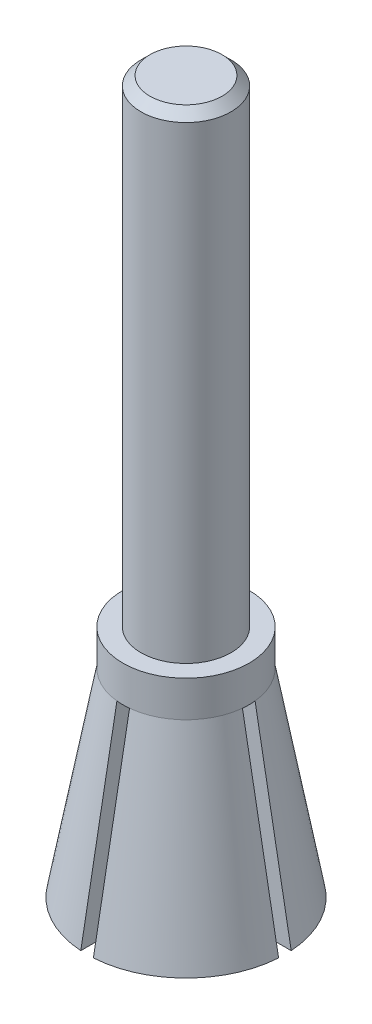
ISO-10303-21;
HEADER;
FILE_DESCRIPTION(('STEP AP214'),'2;1');
FILE_NAME('part.step','',(''),(''),'','','');
FILE_SCHEMA(('AUTOMOTIVE_DESIGN { 1 0 10303 214 1 1 1 1 }'));
ENDSEC;
DATA;
#1=APPLICATION_CONTEXT('core data for automotive mechanical design processes');
#2=APPLICATION_PROTOCOL_DEFINITION('international standard','automotive_design',2000,#1);
#3=PRODUCT_CONTEXT('',#1,'mechanical');
#4=PRODUCT('Part','Part','',(#3));
#5=PRODUCT_RELATED_PRODUCT_CATEGORY('part','',(#4));
#6=PRODUCT_DEFINITION_FORMATION('','',#4);
#7=PRODUCT_DEFINITION_CONTEXT('part definition',#1,'design');
#8=PRODUCT_DEFINITION('design','',#6,#7);
#9=PRODUCT_DEFINITION_SHAPE('','',#8);
#10=(LENGTH_UNIT() NAMED_UNIT(*) SI_UNIT(.MILLI.,.METRE.));
#11=(NAMED_UNIT(*) PLANE_ANGLE_UNIT() SI_UNIT($,.RADIAN.));
#12=(NAMED_UNIT(*) SI_UNIT($,.STERADIAN.) SOLID_ANGLE_UNIT());
#13=UNCERTAINTY_MEASURE_WITH_UNIT(LENGTH_MEASURE(1.E-05),#10,'distance_accuracy_value','');
#14=(GEOMETRIC_REPRESENTATION_CONTEXT(3) GLOBAL_UNCERTAINTY_ASSIGNED_CONTEXT((#13)) GLOBAL_UNIT_ASSIGNED_CONTEXT((#10,
#11,#12)) REPRESENTATION_CONTEXT('',''));
#15=CARTESIAN_POINT('',(0.,0.,0.));
#16=DIRECTION('',(0.,0.,1.));
#17=DIRECTION('',(1.,0.,0.));
#18=AXIS2_PLACEMENT_3D('',#15,#16,#17);
#19=CARTESIAN_POINT('',(0.,0.,0.));
#20=DIRECTION('',(0.,-1.,0.));
#21=DIRECTION('',(0.,0.,1.));
#22=AXIS2_PLACEMENT_3D('',#19,#20,#21);
#23=CONICAL_SURFACE('',#22,5.5,0.179768912955416);
#24=CARTESIAN_POINT('',(0.,11.,0.));
#25=DIRECTION('',(0.,1.,0.));
#26=DIRECTION('',(0.,0.,1.));
#27=AXIS2_PLACEMENT_3D('',#24,#25,#26);
#28=CIRCLE('',#27,3.50096119927712);
#29=CARTESIAN_POINT('',(0.35,11.,3.48342207015514));
#30=VERTEX_POINT('',#29);
#31=CARTESIAN_POINT('',(3.48342207015514,11.,0.349999999999988));
#32=VERTEX_POINT('',#31);
#33=EDGE_CURVE('E292',#30,#32,#28,.T.);
#34=ORIENTED_EDGE('',*,*,#33,.F.);
#35=CARTESIAN_POINT('',(0.350000000000001,22.5495894646429,1.35765620298964));
#36=CARTESIAN_POINT('',(0.350000000000001,22.1599275652389,1.43076601837478));
#37=CARTESIAN_POINT('',(0.350000000000001,21.7702066165525,1.50355977469193));
#38=CARTESIAN_POINT('',(0.350000000000001,20.9906786297959,1.64868315193357));
#39=CARTESIAN_POINT('',(0.35,20.6008715918012,1.72101277326361));
#40=CARTESIAN_POINT('',(0.35,19.4313686685646,1.9375575374505));
#41=CARTESIAN_POINT('',(0.35,18.6515906413776,2.08132864262808));
#42=CARTESIAN_POINT('',(0.35,17.0919202618659,2.36824965370763));
#43=CARTESIAN_POINT('',(0.35,16.3120279095134,2.51139955945829));
#44=CARTESIAN_POINT('',(0.35,14.7521731556098,2.79732677308865));
#45=CARTESIAN_POINT('',(0.35,13.9722107539093,2.9401040801528));
#46=CARTESIAN_POINT('',(0.35,12.4122421040325,3.22541832458637));
#47=CARTESIAN_POINT('',(0.35,11.6322358558618,3.36795526198624));
#48=CARTESIAN_POINT('',(0.35,8.98555155736385,3.85132896909272));
#49=CARTESIAN_POINT('',(0.35,7.11880541120568,4.19179282970911));
#50=CARTESIAN_POINT('',(0.35,3.38523806527127,4.87230942388104));
#51=CARTESIAN_POINT('',(0.35,1.51841686548874,5.21236215740201));
#52=CARTESIAN_POINT('',(0.35,-2.21525422019184,5.89223358945894));
#53=CARTESIAN_POINT('',(0.35,-4.0821041057853,6.23205228966753));
#54=CARTESIAN_POINT('',(0.35,-7.81583054353872,6.91154183330469));
#55=CARTESIAN_POINT('',(0.35,-9.6827070956953,7.25121267675186));
#56=CARTESIAN_POINT('',(0.35,-11.5495894646429,7.59085149434078));
#57=B_SPLINE_CURVE_WITH_KNOTS('',3,(#35,#36,#37,#38,#39,#40,#41,#42,#43,#44,#45,#46,#47,#48,#49,
#50,#51,#52,#53,#54,#55,#56),.UNSPECIFIED.,.F.,.F.,(4,2,2,2,2,2,2,2,2,2,4),(0.,1.18938295723585,
2.37876487507829,4.75752769543539,7.13629109511273,9.51505969710312,11.8938279979318,
17.5864468813084,23.2790662432675,28.971644489105,34.6642220189558),.UNSPECIFIED.);
#58=CARTESIAN_POINT('',(0.35,0.,5.4888523390596));
#59=VERTEX_POINT('',#58);
#60=EDGE_CURVE('E11',#30,#59,#57,.T.);
#61=ORIENTED_EDGE('',*,*,#60,.T.);
#62=CARTESIAN_POINT('',(0.,0.,0.));
#63=DIRECTION('',(0.,1.,0.));
#64=DIRECTION('',(0.,0.,1.));
#65=AXIS2_PLACEMENT_3D('',#62,#63,#64);
#66=CIRCLE('',#65,5.5);
#67=CARTESIAN_POINT('',(5.4888523390596,0.,0.349999999999981));
#68=VERTEX_POINT('',#67);
#69=EDGE_CURVE('E298',#59,#68,#66,.T.);
#70=ORIENTED_EDGE('',*,*,#69,.T.);
#71=CARTESIAN_POINT('',(7.59085149434079,-11.5495894646429,0.349999999999973));
#72=CARTESIAN_POINT('',(7.39855119974482,-10.4925551176123,0.349999999999974));
#73=CARTESIAN_POINT('',(7.20623686367274,-9.43552332483412,0.349999999999975));
#74=CARTESIAN_POINT('',(6.82156990692366,-7.32146679935447,0.349999999999976));
#75=CARTESIAN_POINT('',(6.62921728624994,-6.26444206665241,0.349999999999977));
#76=CARTESIAN_POINT('',(6.24446357860722,-4.15040172248611,0.349999999999978));
#77=CARTESIAN_POINT('',(6.05206249165159,-3.09338611101943,0.349999999999979));
#78=CARTESIAN_POINT('',(5.66719498583401,-0.979366691791477,0.34999999999998));
#79=CARTESIAN_POINT('',(5.47472856696662,0.0776371159687996,0.349999999999981));
#80=CARTESIAN_POINT('',(4.957131292556,2.91957076344735,0.349999999999983));
#81=CARTESIAN_POINT('',(4.63192129273566,4.70448619337983,0.349999999999984));
#82=CARTESIAN_POINT('',(4.14376547701834,7.38179692766072,0.349999999999986));
#83=CARTESIAN_POINT('',(3.98099009320726,8.27422330537217,0.349999999999986));
#84=CARTESIAN_POINT('',(3.65527358788084,10.0590459183619,0.349999999999988));
#85=CARTESIAN_POINT('',(3.49233246634793,10.9514421536369,0.349999999999988));
#86=CARTESIAN_POINT('',(3.16620138836748,12.7361901172948,0.349999999999989));
#87=CARTESIAN_POINT('',(3.00301143166134,13.6285418456304,0.34999999999999));
#88=CARTESIAN_POINT('',(2.67623760777459,15.4131729497828,0.349999999999991));
#89=CARTESIAN_POINT('',(2.51265374071172,16.3054523256213,0.349999999999992));
#90=CARTESIAN_POINT('',(2.26675198053827,17.6437753967331,0.349999999999993));
#91=CARTESIAN_POINT('',(2.18469701207798,18.0898673871044,0.349999999999993));
#92=CARTESIAN_POINT('',(2.02033657077111,18.9820051326434,0.349999999999993));
#93=CARTESIAN_POINT('',(1.93803109797158,19.4280508878199,0.349999999999994));
#94=CARTESIAN_POINT('',(1.77306846868291,20.3200779547064,0.349999999999994));
#95=CARTESIAN_POINT('',(1.69041131180838,20.7660592663453,0.349999999999995));
#96=CARTESIAN_POINT('',(1.52452141501995,21.6579150852303,0.349999999999995));
#97=CARTESIAN_POINT('',(1.44128867472314,22.1037895924051,0.349999999999995));
#98=CARTESIAN_POINT('',(1.35765620298964,22.5495894646429,0.349999999999996));
#99=B_SPLINE_CURVE_WITH_KNOTS('',3,(#71,#72,#73,#74,#75,#76,#77,#78,#79,#80,#81,#82,#83,#84,#85,
#86,#87,#88,#89,#90,#91,#92,#93,#94,#95,#96,#97,#98),.UNSPECIFIED.,.F.,.F.,(4,2,2,2,2,2,2,2,2,2,
2,2,2,4),(0.,3.22315204854954,6.44630382004166,9.66945470324147,12.8926058552499,
18.3355059342359,21.0569551689644,23.7784046923069,26.4998570457867,29.2213085859495,
30.5820361789527,31.9427635164241,33.3034923454792,34.6642220798636),.UNSPECIFIED.);
#100=EDGE_CURVE('E64',#68,#32,#99,.T.);
#101=ORIENTED_EDGE('',*,*,#100,.T.);
#102=EDGE_LOOP('',(#34,#61,#70,#101));
#103=FACE_BOUND('',#102,.T.);
#104=ADVANCED_FACE('F50',(#103),#23,.T.);
#105=CARTESIAN_POINT('',(3.48342207015514,11.,-0.350000000000012));
#106=VERTEX_POINT('',#105);
#107=CARTESIAN_POINT('',(0.349999999999976,11.,-3.48342207015514));
#108=VERTEX_POINT('',#107);
#109=EDGE_CURVE('E396',#106,#108,#28,.T.);
#110=ORIENTED_EDGE('',*,*,#109,.F.);
#111=CARTESIAN_POINT('',(1.35765620298963,22.5495894646429,-0.350000000000005));
#112=CARTESIAN_POINT('',(1.43076601837478,22.1599275652389,-0.350000000000006));
#113=CARTESIAN_POINT('',(1.50355977469193,21.7702066165525,-0.350000000000006));
#114=CARTESIAN_POINT('',(1.64868315193357,20.9906786297959,-0.350000000000006));
#115=CARTESIAN_POINT('',(1.72101277326361,20.6008715918012,-0.350000000000007));
#116=CARTESIAN_POINT('',(1.9375575374505,19.4313686685646,-0.350000000000007));
#117=CARTESIAN_POINT('',(2.08132864262808,18.6515906413776,-0.350000000000008));
#118=CARTESIAN_POINT('',(2.36824965370762,17.0919202618658,-0.350000000000009));
#119=CARTESIAN_POINT('',(2.51139955945829,16.3120279095134,-0.350000000000009));
#120=CARTESIAN_POINT('',(2.79732677308865,14.7521731556098,-0.35000000000001));
#121=CARTESIAN_POINT('',(2.94010408015279,13.9722107539093,-0.350000000000011));
#122=CARTESIAN_POINT('',(3.22541832458637,12.4122421040325,-0.350000000000012));
#123=CARTESIAN_POINT('',(3.36795526198624,11.6322358558618,-0.350000000000012));
#124=CARTESIAN_POINT('',(3.85132896909272,8.98555155736385,-0.350000000000014));
#125=CARTESIAN_POINT('',(4.19179282970911,7.11880541120568,-0.350000000000015));
#126=CARTESIAN_POINT('',(4.87230942388104,3.38523806527127,-0.350000000000017));
#127=CARTESIAN_POINT('',(5.21236215740201,1.51841686548874,-0.350000000000018));
#128=CARTESIAN_POINT('',(5.89223358945894,-2.21525422019184,-0.350000000000021));
#129=CARTESIAN_POINT('',(6.23205228966752,-4.0821041057853,-0.350000000000022));
#130=CARTESIAN_POINT('',(6.91154183330469,-7.81583054353872,-0.350000000000024));
#131=CARTESIAN_POINT('',(7.25121267675186,-9.6827070956953,-0.350000000000025));
#132=CARTESIAN_POINT('',(7.59085149434078,-11.5495894646429,-0.350000000000026));
#133=B_SPLINE_CURVE_WITH_KNOTS('',3,(#111,#112,#113,#114,#115,#116,#117,#118,#119,#120,#121,
#122,#123,#124,#125,#126,#127,#128,#129,#130,#131,#132),.UNSPECIFIED.,.F.,.F.,(4,2,2,2,2,2,2,2,
2,2,4),(0.,1.18938295723585,2.37876487507829,4.75752769543539,7.13629109511273,9.51505969710312,
11.8938279979318,17.5864468813084,23.2790662432675,28.971644489105,34.6642220189558),.UNSPECIFIED.);
#134=CARTESIAN_POINT('',(5.4888523390596,0.,-0.350000000000019));
#135=VERTEX_POINT('',#134);
#136=EDGE_CURVE('E415',#106,#135,#133,.T.);
#137=ORIENTED_EDGE('',*,*,#136,.T.);
#138=CARTESIAN_POINT('',(0.349999999999962,0.,-5.4888523390596));
#139=VERTEX_POINT('',#138);
#140=EDGE_CURVE('E296',#135,#139,#66,.T.);
#141=ORIENTED_EDGE('',*,*,#140,.T.);
#142=CARTESIAN_POINT('',(0.349999999999947,-11.5495894646429,-7.59085149434079));
#143=CARTESIAN_POINT('',(0.349999999999948,-10.4925551176123,-7.39855119974482));
#144=CARTESIAN_POINT('',(0.34999999999995,-9.43552332483412,-7.20623686367275));
#145=CARTESIAN_POINT('',(0.349999999999952,-7.32146679935447,-6.82156990692366));
#146=CARTESIAN_POINT('',(0.349999999999954,-6.26444206665241,-6.62921728624994));
#147=CARTESIAN_POINT('',(0.349999999999956,-4.1504017224861,-6.24446357860722));
#148=CARTESIAN_POINT('',(0.349999999999958,-3.09338611101942,-6.05206249165159));
#149=CARTESIAN_POINT('',(0.34999999999996,-0.979366691791476,-5.66719498583401));
#150=CARTESIAN_POINT('',(0.349999999999962,0.0776371159687994,-5.47472856696662));
#151=CARTESIAN_POINT('',(0.349999999999966,2.91957076344735,-4.957131292556));
#152=CARTESIAN_POINT('',(0.349999999999968,4.70448619337983,-4.63192129273566));
#153=CARTESIAN_POINT('',(0.349999999999971,7.38179692766072,-4.14376547701834));
#154=CARTESIAN_POINT('',(0.349999999999972,8.27422330537217,-3.98099009320726));
#155=CARTESIAN_POINT('',(0.349999999999975,10.0590459183619,-3.65527358788084));
#156=CARTESIAN_POINT('',(0.349999999999976,10.9514421536369,-3.49233246634793));
#157=CARTESIAN_POINT('',(0.349999999999978,12.7361901172948,-3.16620138836748));
#158=CARTESIAN_POINT('',(0.349999999999979,13.6285418456304,-3.00301143166134));
#159=CARTESIAN_POINT('',(0.349999999999982,15.4131729497828,-2.6762376077746));
#160=CARTESIAN_POINT('',(0.349999999999983,16.3054523256213,-2.51265374071172));
#161=CARTESIAN_POINT('',(0.349999999999985,17.6437753967331,-2.26675198053827));
#162=CARTESIAN_POINT('',(0.349999999999985,18.0898673871044,-2.18469701207799));
#163=CARTESIAN_POINT('',(0.349999999999986,18.9820051326434,-2.02033657077112));
#164=CARTESIAN_POINT('',(0.349999999999987,19.4280508878199,-1.93803109797158));
#165=CARTESIAN_POINT('',(0.349999999999988,20.3200779547064,-1.77306846868292));
#166=CARTESIAN_POINT('',(0.349999999999989,20.7660592663453,-1.69041131180838));
#167=CARTESIAN_POINT('',(0.34999999999999,21.6579150852303,-1.52452141501996));
#168=CARTESIAN_POINT('',(0.34999999999999,22.1037895924051,-1.44128867472314));
#169=CARTESIAN_POINT('',(0.349999999999991,22.5495894646429,-1.35765620298964));
#170=B_SPLINE_CURVE_WITH_KNOTS('',3,(#142,#143,#144,#145,#146,#147,#148,#149,#150,#151,#152,
#153,#154,#155,#156,#157,#158,#159,#160,#161,#162,#163,#164,#165,#166,#167,#168,#169),
.UNSPECIFIED.,.F.,.F.,(4,2,2,2,2,2,2,2,2,2,2,2,2,4),(0.,3.22315204854954,6.44630382004166,
9.66945470324148,12.8926058552499,18.3355059342359,21.0569551689644,23.7784046923069,
26.4998570457867,29.2213085859495,30.5820361789527,31.9427635164241,33.3034923454792,
34.6642220798636),.UNSPECIFIED.);
#171=EDGE_CURVE('E418',#139,#108,#170,.T.);
#172=ORIENTED_EDGE('',*,*,#171,.T.);
#173=EDGE_LOOP('',(#110,#137,#141,#172));
#174=FACE_BOUND('',#173,.T.);
#175=ADVANCED_FACE('F362',(#174),#23,.T.);
#176=CARTESIAN_POINT('',(-0.350000000000025,11.,-3.48342207015513));
#177=VERTEX_POINT('',#176);
#178=CARTESIAN_POINT('',(-3.48342207015514,11.,-0.349999999999964));
#179=VERTEX_POINT('',#178);
#180=EDGE_CURVE('E393',#177,#179,#28,.T.);
#181=ORIENTED_EDGE('',*,*,#180,.F.);
#182=CARTESIAN_POINT('',(-0.35000000000001,22.5495894646429,-1.35765620298963));
#183=CARTESIAN_POINT('',(-0.350000000000011,22.1599275652389,-1.43076601837478));
#184=CARTESIAN_POINT('',(-0.350000000000011,21.7702066165525,-1.50355977469193));
#185=CARTESIAN_POINT('',(-0.350000000000012,20.9906786297959,-1.64868315193357));
#186=CARTESIAN_POINT('',(-0.350000000000013,20.6008715918012,-1.72101277326361));
#187=CARTESIAN_POINT('',(-0.350000000000014,19.4313686685646,-1.9375575374505));
#188=CARTESIAN_POINT('',(-0.350000000000015,18.6515906413776,-2.08132864262808));
#189=CARTESIAN_POINT('',(-0.350000000000017,17.0919202618658,-2.36824965370762));
#190=CARTESIAN_POINT('',(-0.350000000000018,16.3120279095134,-2.51139955945829));
#191=CARTESIAN_POINT('',(-0.35000000000002,14.7521731556098,-2.79732677308865));
#192=CARTESIAN_POINT('',(-0.350000000000021,13.9722107539093,-2.94010408015279));
#193=CARTESIAN_POINT('',(-0.350000000000023,12.4122421040325,-3.22541832458637));
#194=CARTESIAN_POINT('',(-0.350000000000024,11.6322358558618,-3.36795526198624));
#195=CARTESIAN_POINT('',(-0.350000000000027,8.98555155736385,-3.85132896909272));
#196=CARTESIAN_POINT('',(-0.35000000000003,7.11880541120568,-4.19179282970911));
#197=CARTESIAN_POINT('',(-0.350000000000034,3.38523806527127,-4.87230942388104));
#198=CARTESIAN_POINT('',(-0.350000000000037,1.51841686548874,-5.21236215740201));
#199=CARTESIAN_POINT('',(-0.350000000000041,-2.21525422019184,-5.89223358945894));
#200=CARTESIAN_POINT('',(-0.350000000000043,-4.08210410578529,-6.23205228966752));
#201=CARTESIAN_POINT('',(-0.350000000000048,-7.81583054353872,-6.91154183330469));
#202=CARTESIAN_POINT('',(-0.35000000000005,-9.6827070956953,-7.25121267675186));
#203=CARTESIAN_POINT('',(-0.350000000000053,-11.5495894646429,-7.59085149434078));
#204=B_SPLINE_CURVE_WITH_KNOTS('',3,(#182,#183,#184,#185,#186,#187,#188,#189,#190,#191,#192,
#193,#194,#195,#196,#197,#198,#199,#200,#201,#202,#203),.UNSPECIFIED.,.F.,.F.,(4,2,2,2,2,2,2,2,
2,2,4),(0.,1.18938295723585,2.37876487507829,4.75752769543539,7.13629109511273,9.51505969710312,
11.8938279979318,17.5864468813084,23.2790662432675,28.971644489105,34.6642220189558),.UNSPECIFIED.);
#205=CARTESIAN_POINT('',(-0.350000000000041,0.,-5.48885233905959));
#206=VERTEX_POINT('',#205);
#207=EDGE_CURVE('E459',#177,#206,#204,.T.);
#208=ORIENTED_EDGE('',*,*,#207,.T.);
#209=CARTESIAN_POINT('',(-5.4888523390596,0.,-0.349999999999943));
#210=VERTEX_POINT('',#209);
#211=EDGE_CURVE('E486',#206,#210,#66,.T.);
#212=ORIENTED_EDGE('',*,*,#211,.T.);
#213=CARTESIAN_POINT('',(-7.59085149434079,-11.5495894646429,-0.34999999999992));
#214=CARTESIAN_POINT('',(-7.39855119974482,-10.4925551176123,-0.349999999999922));
#215=CARTESIAN_POINT('',(-7.20623686367275,-9.43552332483412,-0.349999999999924));
#216=CARTESIAN_POINT('',(-6.82156990692366,-7.32146679935447,-0.349999999999929));
#217=CARTESIAN_POINT('',(-6.62921728624994,-6.26444206665241,-0.349999999999931));
#218=CARTESIAN_POINT('',(-6.24446357860722,-4.15040172248611,-0.349999999999935));
#219=CARTESIAN_POINT('',(-6.05206249165159,-3.09338611101943,-0.349999999999937));
#220=CARTESIAN_POINT('',(-5.66719498583401,-0.979366691791477,-0.349999999999941));
#221=CARTESIAN_POINT('',(-5.47472856696662,0.0776371159687996,-0.349999999999943));
#222=CARTESIAN_POINT('',(-4.95713129255601,2.91957076344735,-0.349999999999948));
#223=CARTESIAN_POINT('',(-4.63192129273566,4.70448619337983,-0.349999999999952));
#224=CARTESIAN_POINT('',(-4.14376547701834,7.38179692766072,-0.349999999999957));
#225=CARTESIAN_POINT('',(-3.98099009320726,8.27422330537217,-0.349999999999959));
#226=CARTESIAN_POINT('',(-3.65527358788084,10.0590459183619,-0.349999999999962));
#227=CARTESIAN_POINT('',(-3.49233246634793,10.9514421536369,-0.349999999999964));
#228=CARTESIAN_POINT('',(-3.16620138836748,12.7361901172948,-0.349999999999967));
#229=CARTESIAN_POINT('',(-3.00301143166134,13.6285418456304,-0.349999999999969));
#230=CARTESIAN_POINT('',(-2.6762376077746,15.4131729497828,-0.349999999999973));
#231=CARTESIAN_POINT('',(-2.51265374071172,16.3054523256213,-0.349999999999974));
#232=CARTESIAN_POINT('',(-2.26675198053827,17.6437753967331,-0.349999999999977));
#233=CARTESIAN_POINT('',(-2.18469701207799,18.0898673871044,-0.349999999999978));
#234=CARTESIAN_POINT('',(-2.02033657077112,18.9820051326434,-0.34999999999998));
#235=CARTESIAN_POINT('',(-1.93803109797158,19.4280508878199,-0.34999999999998));
#236=CARTESIAN_POINT('',(-1.77306846868292,20.3200779547064,-0.349999999999982));
#237=CARTESIAN_POINT('',(-1.69041131180839,20.7660592663453,-0.349999999999983));
#238=CARTESIAN_POINT('',(-1.52452141501996,21.6579150852303,-0.349999999999985));
#239=CARTESIAN_POINT('',(-1.44128867472314,22.1037895924051,-0.349999999999986));
#240=CARTESIAN_POINT('',(-1.35765620298964,22.5495894646429,-0.349999999999987));
#241=B_SPLINE_CURVE_WITH_KNOTS('',3,(#213,#214,#215,#216,#217,#218,#219,#220,#221,#222,#223,
#224,#225,#226,#227,#228,#229,#230,#231,#232,#233,#234,#235,#236,#237,#238,#239,#240),
.UNSPECIFIED.,.F.,.F.,(4,2,2,2,2,2,2,2,2,2,2,2,2,4),(0.,3.22315204854954,6.44630382004166,
9.66945470324147,12.8926058552499,18.3355059342359,21.0569551689644,23.7784046923069,
26.4998570457867,29.2213085859495,30.5820361789527,31.9427635164241,33.3034923454792,
34.6642220798636),.UNSPECIFIED.);
#242=EDGE_CURVE('E469',#210,#179,#241,.T.);
#243=ORIENTED_EDGE('',*,*,#242,.T.);
#244=EDGE_LOOP('',(#181,#208,#212,#243));
#245=FACE_BOUND('',#244,.T.);
#246=ADVANCED_FACE('F352',(#245),#23,.T.);
#247=CARTESIAN_POINT('',(0.,0.,0.));
#248=DIRECTION('',(0.,1.,0.));
#249=DIRECTION('',(0.,0.,1.));
#250=AXIS2_PLACEMENT_3D('',#247,#248,#249);
#251=PLANE('',#250);
#252=DIRECTION('',(0.,0.,-1.));
#253=VECTOR('',#252,1.);
#254=CARTESIAN_POINT('',(-0.35,0.,5.4888523390596));
#255=LINE('',#254,#253);
#256=CARTESIAN_POINT('',(-0.35,0.,5.4888523390596));
#257=VERTEX_POINT('',#256);
#258=CARTESIAN_POINT('',(-0.35,0.,1.96913686675152));
#259=VERTEX_POINT('',#258);
#260=EDGE_CURVE('E182',#257,#259,#255,.T.);
#261=ORIENTED_EDGE('',*,*,#260,.F.);
#262=CARTESIAN_POINT('',(-5.48885233905959,0.,0.35000000000006));
#263=VERTEX_POINT('',#262);
#264=EDGE_CURVE('E293',#263,#257,#66,.T.);
#265=ORIENTED_EDGE('',*,*,#264,.F.);
#266=DIRECTION('',(-1.,0.,0.));
#267=VECTOR('',#266,1.);
#268=CARTESIAN_POINT('',(-5.48885233905959,0.,0.350000000000057));
#269=LINE('',#268,#267);
#270=CARTESIAN_POINT('',(-1.96913686675152,0.,0.350000000000021));
#271=VERTEX_POINT('',#270);
#272=EDGE_CURVE('E226',#271,#263,#269,.T.);
#273=ORIENTED_EDGE('',*,*,#272,.F.);
#274=CARTESIAN_POINT('',(0.,0.,0.));
#275=DIRECTION('',(0.,-1.,0.));
#276=DIRECTION('',(0.,0.,-1.));
#277=AXIS2_PLACEMENT_3D('',#274,#275,#276);
#278=CIRCLE('',#277,2.);
#279=EDGE_CURVE('E229',#259,#271,#278,.T.);
#280=ORIENTED_EDGE('',*,*,#279,.F.);
#281=EDGE_LOOP('',(#261,#265,#273,#280));
#282=FACE_BOUND('',#281,.T.);
#283=ADVANCED_FACE('F348',(#282),#251,.F.);
#284=DIRECTION('',(1.,0.,0.));
#285=VECTOR('',#284,1.);
#286=CARTESIAN_POINT('',(-5.4888523390596,0.,-0.349999999999943));
#287=LINE('',#286,#285);
#288=CARTESIAN_POINT('',(-1.96913686675152,0.,-0.34999999999998));
#289=VERTEX_POINT('',#288);
#290=EDGE_CURVE('E235',#210,#289,#287,.T.);
#291=ORIENTED_EDGE('',*,*,#290,.F.);
#292=ORIENTED_EDGE('',*,*,#211,.F.);
#293=DIRECTION('',(0.,0.,-1.));
#294=VECTOR('',#293,1.);
#295=CARTESIAN_POINT('',(-0.350000000000038,0.,-5.48885233905959));
#296=LINE('',#295,#294);
#297=CARTESIAN_POINT('',(-0.350000000000014,0.,-1.96913686675152));
#298=VERTEX_POINT('',#297);
#299=EDGE_CURVE('E243',#298,#206,#296,.T.);
#300=ORIENTED_EDGE('',*,*,#299,.F.);
#301=CARTESIAN_POINT('',(0.,0.,0.));
#302=DIRECTION('',(0.,-1.,0.));
#303=DIRECTION('',(0.,0.,-1.));
#304=AXIS2_PLACEMENT_3D('',#301,#302,#303);
#305=CIRCLE('',#304,2.);
#306=EDGE_CURVE('E240',#289,#298,#305,.T.);
#307=ORIENTED_EDGE('',*,*,#306,.F.);
#308=EDGE_LOOP('',(#291,#292,#300,#307));
#309=FACE_BOUND('',#308,.T.);
#310=ADVANCED_FACE('F354',(#309),#251,.F.);
#311=DIRECTION('',(0.,0.,1.));
#312=VECTOR('',#311,1.);
#313=CARTESIAN_POINT('',(0.349999999999962,0.,-5.4888523390596));
#314=LINE('',#313,#312);
#315=CARTESIAN_POINT('',(0.349999999999987,0.,-1.96913686675152));
#316=VERTEX_POINT('',#315);
#317=EDGE_CURVE('E245',#139,#316,#314,.T.);
#318=ORIENTED_EDGE('',*,*,#317,.F.);
#319=ORIENTED_EDGE('',*,*,#140,.F.);
#320=DIRECTION('',(1.,0.,0.));
#321=VECTOR('',#320,1.);
#322=CARTESIAN_POINT('',(5.4888523390596,0.,-0.350000000000019));
#323=LINE('',#322,#321);
#324=CARTESIAN_POINT('',(1.96913686675152,0.,-0.350000000000007));
#325=VERTEX_POINT('',#324);
#326=EDGE_CURVE('E252',#325,#135,#323,.T.);
#327=ORIENTED_EDGE('',*,*,#326,.F.);
#328=CARTESIAN_POINT('',(0.,0.,0.));
#329=DIRECTION('',(0.,-1.,0.));
#330=DIRECTION('',(0.,0.,-1.));
#331=AXIS2_PLACEMENT_3D('',#328,#329,#330);
#332=CIRCLE('',#331,2.);
#333=EDGE_CURVE('E250',#316,#325,#332,.T.);
#334=ORIENTED_EDGE('',*,*,#333,.F.);
#335=EDGE_LOOP('',(#318,#319,#327,#334));
#336=FACE_BOUND('',#335,.T.);
#337=ADVANCED_FACE('F357',(#336),#251,.F.);
#338=DIRECTION('',(-1.,0.,0.));
#339=VECTOR('',#338,1.);
#340=CARTESIAN_POINT('',(5.4888523390596,0.,0.349999999999981));
#341=LINE('',#340,#339);
#342=CARTESIAN_POINT('',(1.96913686675152,0.,0.349999999999994));
#343=VERTEX_POINT('',#342);
#344=EDGE_CURVE('E254',#68,#343,#341,.T.);
#345=ORIENTED_EDGE('',*,*,#344,.F.);
#346=ORIENTED_EDGE('',*,*,#69,.F.);
#347=DIRECTION('',(0.,0.,1.));
#348=VECTOR('',#347,1.);
#349=CARTESIAN_POINT('',(0.35,0.,5.4888523390596));
#350=LINE('',#349,#348);
#351=CARTESIAN_POINT('',(0.35,0.,1.96913686675152));
#352=VERTEX_POINT('',#351);
#353=EDGE_CURVE('E171',#352,#59,#350,.T.);
#354=ORIENTED_EDGE('',*,*,#353,.F.);
#355=CARTESIAN_POINT('',(0.,0.,0.));
#356=DIRECTION('',(0.,-1.,0.));
#357=DIRECTION('',(0.,0.,-1.));
#358=AXIS2_PLACEMENT_3D('',#355,#356,#357);
#359=CIRCLE('',#358,2.);
#360=EDGE_CURVE('E259',#343,#352,#359,.T.);
#361=ORIENTED_EDGE('',*,*,#360,.F.);
#362=EDGE_LOOP('',(#345,#346,#354,#361));
#363=FACE_BOUND('',#362,.T.);
#364=ADVANCED_FACE('F351',(#363),#251,.F.);
#365=CARTESIAN_POINT('',(-3.48342207015513,11.,0.350000000000036));
#366=VERTEX_POINT('',#365);
#367=CARTESIAN_POINT('',(-0.35,11.,3.48342207015514));
#368=VERTEX_POINT('',#367);
#369=EDGE_CURVE('E381',#366,#368,#28,.T.);
#370=ORIENTED_EDGE('',*,*,#369,.F.);
#371=CARTESIAN_POINT('',(-1.35765620298963,22.5495894646429,0.350000000000015));
#372=CARTESIAN_POINT('',(-1.43076601837478,22.1599275652389,0.350000000000015));
#373=CARTESIAN_POINT('',(-1.50355977469193,21.7702066165525,0.350000000000016));
#374=CARTESIAN_POINT('',(-1.64868315193357,20.9906786297959,0.350000000000018));
#375=CARTESIAN_POINT('',(-1.72101277326361,20.6008715918012,0.350000000000018));
#376=CARTESIAN_POINT('',(-1.93755753745049,19.4313686685646,0.35000000000002));
#377=CARTESIAN_POINT('',(-2.08132864262808,18.6515906413776,0.350000000000022));
#378=CARTESIAN_POINT('',(-2.36824965370762,17.0919202618658,0.350000000000025));
#379=CARTESIAN_POINT('',(-2.51139955945829,16.3120279095134,0.350000000000027));
#380=CARTESIAN_POINT('',(-2.79732677308865,14.7521731556098,0.350000000000029));
#381=CARTESIAN_POINT('',(-2.94010408015279,13.9722107539093,0.350000000000031));
#382=CARTESIAN_POINT('',(-3.22541832458637,12.4122421040325,0.350000000000034));
#383=CARTESIAN_POINT('',(-3.36795526198624,11.6322358558618,0.350000000000035));
#384=CARTESIAN_POINT('',(-3.85132896909271,8.98555155736385,0.35000000000004));
#385=CARTESIAN_POINT('',(-4.19179282970911,7.11880541120568,0.350000000000044));
#386=CARTESIAN_POINT('',(-4.87230942388103,3.38523806527127,0.350000000000051));
#387=CARTESIAN_POINT('',(-5.212362157402,1.51841686548874,0.350000000000054));
#388=CARTESIAN_POINT('',(-5.89223358945893,-2.21525422019184,0.350000000000062));
#389=CARTESIAN_POINT('',(-6.23205228966752,-4.08210410578529,0.350000000000065));
#390=CARTESIAN_POINT('',(-6.91154183330469,-7.81583054353872,0.350000000000072));
#391=CARTESIAN_POINT('',(-7.25121267675186,-9.6827070956953,0.350000000000076));
#392=CARTESIAN_POINT('',(-7.59085149434078,-11.5495894646429,0.350000000000079));
#393=B_SPLINE_CURVE_WITH_KNOTS('',3,(#371,#372,#373,#374,#375,#376,#377,#378,#379,#380,#381,
#382,#383,#384,#385,#386,#387,#388,#389,#390,#391,#392),.UNSPECIFIED.,.F.,.F.,(4,2,2,2,2,2,2,2,
2,2,4),(0.,1.18938295723585,2.37876487507829,4.75752769543539,7.13629109511273,9.51505969710312,
11.8938279979318,17.5864468813084,23.2790662432675,28.971644489105,34.6642220189558),.UNSPECIFIED.);
#394=EDGE_CURVE('E319',#366,#263,#393,.T.);
#395=ORIENTED_EDGE('',*,*,#394,.T.);
#396=ORIENTED_EDGE('',*,*,#264,.T.);
#397=CARTESIAN_POINT('',(-0.35,-11.5495894646429,7.59085149434078));
#398=CARTESIAN_POINT('',(-0.35,-10.4925551176123,7.39855119974482));
#399=CARTESIAN_POINT('',(-0.35,-9.43552332483412,7.20623686367274));
#400=CARTESIAN_POINT('',(-0.35,-7.32146679935447,6.82156990692366));
#401=CARTESIAN_POINT('',(-0.35,-6.26444206665241,6.62921728624994));
#402=CARTESIAN_POINT('',(-0.35,-4.15040172248611,6.24446357860722));
#403=CARTESIAN_POINT('',(-0.35,-3.09338611101942,6.05206249165159));
#404=CARTESIAN_POINT('',(-0.35,-0.979366691791477,5.66719498583401));
#405=CARTESIAN_POINT('',(-0.35,0.0776371159687999,5.47472856696661));
#406=CARTESIAN_POINT('',(-0.35,2.91957076344735,4.957131292556));
#407=CARTESIAN_POINT('',(-0.35,4.70448619337983,4.63192129273566));
#408=CARTESIAN_POINT('',(-0.35,7.38179692766072,4.14376547701834));
#409=CARTESIAN_POINT('',(-0.35,8.27422330537217,3.98099009320726));
#410=CARTESIAN_POINT('',(-0.35,10.0590459183619,3.65527358788084));
#411=CARTESIAN_POINT('',(-0.35,10.9514421536369,3.49233246634793));
#412=CARTESIAN_POINT('',(-0.35,12.7361901172948,3.16620138836748));
#413=CARTESIAN_POINT('',(-0.35,13.6285418456304,3.00301143166134));
#414=CARTESIAN_POINT('',(-0.35,15.4131729497828,2.67623760777459));
#415=CARTESIAN_POINT('',(-0.35,16.3054523256212,2.51265374071172));
#416=CARTESIAN_POINT('',(-0.35,17.6437753967331,2.26675198053827));
#417=CARTESIAN_POINT('',(-0.35,18.0898673871044,2.18469701207798));
#418=CARTESIAN_POINT('',(-0.35,18.9820051326434,2.02033657077111));
#419=CARTESIAN_POINT('',(-0.35,19.4280508878199,1.93803109797158));
#420=CARTESIAN_POINT('',(-0.35,20.3200779547064,1.77306846868291));
#421=CARTESIAN_POINT('',(-0.350000000000001,20.7660592663453,1.69041131180838));
#422=CARTESIAN_POINT('',(-0.350000000000001,21.6579150852303,1.52452141501995));
#423=CARTESIAN_POINT('',(-0.350000000000001,22.1037895924051,1.44128867472314));
#424=CARTESIAN_POINT('',(-0.350000000000001,22.5495894646429,1.35765620298964));
#425=B_SPLINE_CURVE_WITH_KNOTS('',3,(#397,#398,#399,#400,#401,#402,#403,#404,#405,#406,#407,
#408,#409,#410,#411,#412,#413,#414,#415,#416,#417,#418,#419,#420,#421,#422,#423,#424),
.UNSPECIFIED.,.F.,.F.,(4,2,2,2,2,2,2,2,2,2,2,2,2,4),(0.,3.22315204854954,6.44630382004166,
9.66945470324148,12.8926058552499,18.3355059342359,21.0569551689644,23.7784046923069,
26.4998570457867,29.2213085859495,30.5820361789527,31.9427635164241,33.3034923454792,
34.6642220798636),.UNSPECIFIED.);
#426=EDGE_CURVE('E315',#257,#368,#425,.T.);
#427=ORIENTED_EDGE('',*,*,#426,.T.);
#428=EDGE_LOOP('',(#370,#395,#396,#427));
#429=FACE_BOUND('',#428,.T.);
#430=ADVANCED_FACE('F330',(#429),#23,.T.);
#431=CARTESIAN_POINT('',(0.,13.,0.));
#432=DIRECTION('',(0.,-1.,0.));
#433=DIRECTION('',(0.,0.,-1.));
#434=AXIS2_PLACEMENT_3D('',#431,#432,#433);
#435=CYLINDRICAL_SURFACE('',#434,3.50096119927712);
#436=CARTESIAN_POINT('',(0.,13.,0.));
#437=DIRECTION('',(0.,1.,0.));
#438=DIRECTION('',(0.,0.,1.));
#439=AXIS2_PLACEMENT_3D('',#436,#437,#438);
#440=CIRCLE('',#439,3.50096119927712);
#441=CARTESIAN_POINT('',(0.,13.,3.50096119927712));
#442=VERTEX_POINT('',#441);
#443=EDGE_CURVE('E268',#442,#442,#440,.T.);
#444=ORIENTED_EDGE('',*,*,#443,.F.);
#445=EDGE_LOOP('',(#444));
#446=FACE_BOUND('',#445,.T.);
#447=ORIENTED_EDGE('',*,*,#33,.T.);
#448=EDGE_CURVE('E303',#32,#106,#28,.T.);
#449=ORIENTED_EDGE('',*,*,#448,.T.);
#450=ORIENTED_EDGE('',*,*,#109,.T.);
#451=EDGE_CURVE('E391',#108,#177,#28,.T.);
#452=ORIENTED_EDGE('',*,*,#451,.T.);
#453=ORIENTED_EDGE('',*,*,#180,.T.);
#454=EDGE_CURVE('E390',#179,#366,#28,.T.);
#455=ORIENTED_EDGE('',*,*,#454,.T.);
#456=ORIENTED_EDGE('',*,*,#369,.T.);
#457=EDGE_CURVE('E78',#368,#30,#28,.T.);
#458=ORIENTED_EDGE('',*,*,#457,.T.);
#459=EDGE_LOOP('',(#447,#449,#450,#452,#453,#455,#456,#458));
#460=FACE_BOUND('',#459,.T.);
#461=ADVANCED_FACE('F347',(#446,#460),#435,.T.);
#462=CARTESIAN_POINT('',(0.,13.,0.));
#463=DIRECTION('',(0.,1.,0.));
#464=DIRECTION('',(0.,0.,1.));
#465=AXIS2_PLACEMENT_3D('',#462,#463,#464);
#466=PLANE('',#465);
#467=CARTESIAN_POINT('',(0.,13.,0.));
#468=DIRECTION('',(0.,1.,0.));
#469=DIRECTION('',(0.,0.,1.));
#470=AXIS2_PLACEMENT_3D('',#467,#468,#469);
#471=CIRCLE('',#470,2.5);
#472=CARTESIAN_POINT('',(0.,13.,2.5));
#473=VERTEX_POINT('',#472);
#474=EDGE_CURVE('E289',#473,#473,#471,.T.);
#475=ORIENTED_EDGE('',*,*,#474,.F.);
#476=EDGE_LOOP('',(#475));
#477=FACE_BOUND('',#476,.T.);
#478=ORIENTED_EDGE('',*,*,#443,.T.);
#479=EDGE_LOOP('',(#478));
#480=FACE_BOUND('',#479,.T.);
#481=ADVANCED_FACE('F341',(#477,#480),#466,.T.);
#482=CARTESIAN_POINT('',(0.,39.5,0.));
#483=DIRECTION('',(0.,-1.,0.));
#484=DIRECTION('',(0.,0.,-1.));
#485=AXIS2_PLACEMENT_3D('',#482,#483,#484);
#486=CYLINDRICAL_SURFACE('',#485,2.5);
#487=CARTESIAN_POINT('',(0.,39.,0.));
#488=DIRECTION('',(0.,1.,0.));
#489=DIRECTION('',(0.,0.,1.));
#490=AXIS2_PLACEMENT_3D('',#487,#488,#489);
#491=CIRCLE('',#490,2.5);
#492=CARTESIAN_POINT('',(0.,39.,2.5));
#493=VERTEX_POINT('',#492);
#494=EDGE_CURVE('E306',#493,#493,#491,.F.);
#495=ORIENTED_EDGE('',*,*,#494,.T.);
#496=EDGE_LOOP('',(#495));
#497=FACE_BOUND('',#496,.T.);
#498=ORIENTED_EDGE('',*,*,#474,.T.);
#499=EDGE_LOOP('',(#498));
#500=FACE_BOUND('',#499,.T.);
#501=ADVANCED_FACE('F337',(#497,#500),#486,.T.);
#502=CARTESIAN_POINT('',(0.,39.5,0.));
#503=DIRECTION('',(0.,1.,0.));
#504=DIRECTION('',(0.,0.,1.));
#505=AXIS2_PLACEMENT_3D('',#502,#503,#504);
#506=PLANE('',#505);
#507=CARTESIAN_POINT('',(0.,39.5,0.));
#508=DIRECTION('',(0.,1.,0.));
#509=DIRECTION('',(0.,0.,1.));
#510=AXIS2_PLACEMENT_3D('',#507,#508,#509);
#511=CIRCLE('',#510,2.);
#512=CARTESIAN_POINT('',(0.,39.5,2.));
#513=VERTEX_POINT('',#512);
#514=EDGE_CURVE('E287',#513,#513,#511,.T.);
#515=ORIENTED_EDGE('',*,*,#514,.T.);
#516=EDGE_LOOP('',(#515));
#517=FACE_BOUND('',#516,.T.);
#518=ADVANCED_FACE('F333',(#517),#506,.T.);
#519=CARTESIAN_POINT('',(0.,39.5,0.));
#520=DIRECTION('',(0.,-1.,0.));
#521=DIRECTION('',(0.,0.,-1.));
#522=AXIS2_PLACEMENT_3D('',#519,#520,#521);
#523=CONICAL_SURFACE('',#522,2.,0.785398163397446);
#524=ORIENTED_EDGE('',*,*,#494,.F.);
#525=EDGE_LOOP('',(#524));
#526=FACE_BOUND('',#525,.T.);
#527=ORIENTED_EDGE('',*,*,#514,.F.);
#528=EDGE_LOOP('',(#527));
#529=FACE_BOUND('',#528,.T.);
#530=ADVANCED_FACE('F49',(#526,#529),#523,.T.);
#531=CARTESIAN_POINT('',(0.35,11.,5.4888523390596));
#532=DIRECTION('',(1.,0.,0.));
#533=DIRECTION('',(0.,0.,-1.));
#534=AXIS2_PLACEMENT_3D('',#531,#532,#533);
#535=PLANE('',#534);
#536=DIRECTION('',(0.,0.,1.));
#537=VECTOR('',#536,1.);
#538=CARTESIAN_POINT('',(0.35,11.,5.4888523390596));
#539=LINE('',#538,#537);
#540=CARTESIAN_POINT('',(0.35,11.,1.96913686675152));
#541=VERTEX_POINT('',#540);
#542=EDGE_CURVE('E189',#541,#30,#539,.T.);
#543=ORIENTED_EDGE('',*,*,#542,.F.);
#544=DIRECTION('',(0.,-1.,0.));
#545=VECTOR('',#544,1.);
#546=CARTESIAN_POINT('',(0.35,11.,1.96913686675152));
#547=LINE('',#546,#545);
#548=EDGE_CURVE('E264',#541,#352,#547,.T.);
#549=ORIENTED_EDGE('',*,*,#548,.T.);
#550=ORIENTED_EDGE('',*,*,#353,.T.);
#551=ORIENTED_EDGE('',*,*,#60,.F.);
#552=EDGE_LOOP('',(#543,#549,#550,#551));
#553=FACE_BOUND('',#552,.T.);
#554=ADVANCED_FACE('F433',(#553),#535,.F.);
#555=CARTESIAN_POINT('',(5.4888523390596,11.,0.349999999999981));
#556=DIRECTION('',(0.,0.,1.));
#557=DIRECTION('',(1.,0.,0.));
#558=AXIS2_PLACEMENT_3D('',#555,#556,#557);
#559=PLANE('',#558);
#560=ORIENTED_EDGE('',*,*,#344,.T.);
#561=DIRECTION('',(0.,-1.,0.));
#562=VECTOR('',#561,1.);
#563=CARTESIAN_POINT('',(1.96913686675152,11.,0.349999999999994));
#564=LINE('',#563,#562);
#565=CARTESIAN_POINT('',(1.96913686675152,11.,0.349999999999994));
#566=VERTEX_POINT('',#565);
#567=EDGE_CURVE('E267',#566,#343,#564,.T.);
#568=ORIENTED_EDGE('',*,*,#567,.F.);
#569=DIRECTION('',(-1.,0.,0.));
#570=VECTOR('',#569,1.);
#571=CARTESIAN_POINT('',(5.4888523390596,11.,0.349999999999981));
#572=LINE('',#571,#570);
#573=EDGE_CURVE('E216',#32,#566,#572,.T.);
#574=ORIENTED_EDGE('',*,*,#573,.F.);
#575=ORIENTED_EDGE('',*,*,#100,.F.);
#576=EDGE_LOOP('',(#560,#568,#574,#575));
#577=FACE_BOUND('',#576,.T.);
#578=ADVANCED_FACE('F407',(#577),#559,.F.);
#579=CARTESIAN_POINT('',(5.4888523390596,11.,-0.350000000000019));
#580=DIRECTION('',(0.,0.,-1.));
#581=DIRECTION('',(-1.,0.,0.));
#582=AXIS2_PLACEMENT_3D('',#579,#580,#581);
#583=PLANE('',#582);
#584=DIRECTION('',(1.,0.,0.));
#585=VECTOR('',#584,1.);
#586=CARTESIAN_POINT('',(5.4888523390596,11.,-0.350000000000019));
#587=LINE('',#586,#585);
#588=CARTESIAN_POINT('',(1.96913686675152,11.,-0.350000000000007));
#589=VERTEX_POINT('',#588);
#590=EDGE_CURVE('E215',#589,#106,#587,.T.);
#591=ORIENTED_EDGE('',*,*,#590,.F.);
#592=DIRECTION('',(0.,-1.,0.));
#593=VECTOR('',#592,1.);
#594=CARTESIAN_POINT('',(1.96913686675152,11.,-0.350000000000007));
#595=LINE('',#594,#593);
#596=EDGE_CURVE('E275',#589,#325,#595,.T.);
#597=ORIENTED_EDGE('',*,*,#596,.T.);
#598=ORIENTED_EDGE('',*,*,#326,.T.);
#599=ORIENTED_EDGE('',*,*,#136,.F.);
#600=EDGE_LOOP('',(#591,#597,#598,#599));
#601=FACE_BOUND('',#600,.T.);
#602=ADVANCED_FACE('F435',(#601),#583,.F.);
#603=CARTESIAN_POINT('',(0.349999999999962,11.,-5.4888523390596));
#604=DIRECTION('',(1.,0.,0.));
#605=DIRECTION('',(0.,0.,-1.));
#606=AXIS2_PLACEMENT_3D('',#603,#604,#605);
#607=PLANE('',#606);
#608=ORIENTED_EDGE('',*,*,#317,.T.);
#609=DIRECTION('',(0.,-1.,0.));
#610=VECTOR('',#609,1.);
#611=CARTESIAN_POINT('',(0.349999999999987,11.,-1.96913686675152));
#612=LINE('',#611,#610);
#613=CARTESIAN_POINT('',(0.349999999999987,11.,-1.96913686675152));
#614=VERTEX_POINT('',#613);
#615=EDGE_CURVE('E274',#614,#316,#612,.T.);
#616=ORIENTED_EDGE('',*,*,#615,.F.);
#617=DIRECTION('',(0.,0.,1.));
#618=VECTOR('',#617,1.);
#619=CARTESIAN_POINT('',(0.349999999999962,11.,-5.4888523390596));
#620=LINE('',#619,#618);
#621=EDGE_CURVE('E202',#108,#614,#620,.T.);
#622=ORIENTED_EDGE('',*,*,#621,.F.);
#623=ORIENTED_EDGE('',*,*,#171,.F.);
#624=EDGE_LOOP('',(#608,#616,#622,#623));
#625=FACE_BOUND('',#624,.T.);
#626=ADVANCED_FACE('F437',(#625),#607,.F.);
#627=CARTESIAN_POINT('',(-0.350000000000038,11.,-5.48885233905959));
#628=DIRECTION('',(-1.,0.,0.));
#629=DIRECTION('',(0.,0.,1.));
#630=AXIS2_PLACEMENT_3D('',#627,#628,#629);
#631=PLANE('',#630);
#632=DIRECTION('',(0.,0.,-1.));
#633=VECTOR('',#632,1.);
#634=CARTESIAN_POINT('',(-0.350000000000038,11.,-5.48885233905959));
#635=LINE('',#634,#633);
#636=CARTESIAN_POINT('',(-0.350000000000014,11.,-1.96913686675152));
#637=VERTEX_POINT('',#636);
#638=EDGE_CURVE('E68',#637,#177,#635,.T.);
#639=ORIENTED_EDGE('',*,*,#638,.F.);
#640=DIRECTION('',(0.,-1.,0.));
#641=VECTOR('',#640,1.);
#642=CARTESIAN_POINT('',(-0.350000000000014,11.,-1.96913686675152));
#643=LINE('',#642,#641);
#644=EDGE_CURVE('E279',#637,#298,#643,.T.);
#645=ORIENTED_EDGE('',*,*,#644,.T.);
#646=ORIENTED_EDGE('',*,*,#299,.T.);
#647=ORIENTED_EDGE('',*,*,#207,.F.);
#648=EDGE_LOOP('',(#639,#645,#646,#647));
#649=FACE_BOUND('',#648,.T.);
#650=ADVANCED_FACE('F447',(#649),#631,.F.);
#651=CARTESIAN_POINT('',(-5.4888523390596,11.,-0.349999999999943));
#652=DIRECTION('',(0.,0.,-1.));
#653=DIRECTION('',(-1.,0.,0.));
#654=AXIS2_PLACEMENT_3D('',#651,#652,#653);
#655=PLANE('',#654);
#656=ORIENTED_EDGE('',*,*,#290,.T.);
#657=DIRECTION('',(0.,-1.,0.));
#658=VECTOR('',#657,1.);
#659=CARTESIAN_POINT('',(-1.96913686675152,11.,-0.34999999999998));
#660=LINE('',#659,#658);
#661=CARTESIAN_POINT('',(-1.96913686675152,11.,-0.34999999999998));
#662=VERTEX_POINT('',#661);
#663=EDGE_CURVE('E283',#662,#289,#660,.T.);
#664=ORIENTED_EDGE('',*,*,#663,.F.);
#665=DIRECTION('',(1.,0.,0.));
#666=VECTOR('',#665,1.);
#667=CARTESIAN_POINT('',(-5.4888523390596,11.,-0.349999999999943));
#668=LINE('',#667,#666);
#669=EDGE_CURVE('E192',#179,#662,#668,.T.);
#670=ORIENTED_EDGE('',*,*,#669,.F.);
#671=ORIENTED_EDGE('',*,*,#242,.F.);
#672=EDGE_LOOP('',(#656,#664,#670,#671));
#673=FACE_BOUND('',#672,.T.);
#674=ADVANCED_FACE('F475',(#673),#655,.F.);
#675=CARTESIAN_POINT('',(-5.48885233905959,11.,0.350000000000057));
#676=DIRECTION('',(0.,0.,1.));
#677=DIRECTION('',(1.,0.,0.));
#678=AXIS2_PLACEMENT_3D('',#675,#676,#677);
#679=PLANE('',#678);
#680=DIRECTION('',(-1.,0.,0.));
#681=VECTOR('',#680,1.);
#682=CARTESIAN_POINT('',(-5.48885233905959,11.,0.350000000000057));
#683=LINE('',#682,#681);
#684=CARTESIAN_POINT('',(-1.96913686675152,11.,0.350000000000021));
#685=VERTEX_POINT('',#684);
#686=EDGE_CURVE('E191',#685,#366,#683,.T.);
#687=ORIENTED_EDGE('',*,*,#686,.F.);
#688=DIRECTION('',(0.,-1.,0.));
#689=VECTOR('',#688,1.);
#690=CARTESIAN_POINT('',(-1.96913686675152,11.,0.350000000000021));
#691=LINE('',#690,#689);
#692=EDGE_CURVE('E188',#685,#271,#691,.T.);
#693=ORIENTED_EDGE('',*,*,#692,.T.);
#694=ORIENTED_EDGE('',*,*,#272,.T.);
#695=ORIENTED_EDGE('',*,*,#394,.F.);
#696=EDGE_LOOP('',(#687,#693,#694,#695));
#697=FACE_BOUND('',#696,.T.);
#698=ADVANCED_FACE('F331',(#697),#679,.F.);
#699=CARTESIAN_POINT('',(-0.35,11.,5.4888523390596));
#700=DIRECTION('',(-1.,0.,0.));
#701=DIRECTION('',(0.,0.,1.));
#702=AXIS2_PLACEMENT_3D('',#699,#700,#701);
#703=PLANE('',#702);
#704=ORIENTED_EDGE('',*,*,#260,.T.);
#705=DIRECTION('',(0.,-1.,0.));
#706=VECTOR('',#705,1.);
#707=CARTESIAN_POINT('',(-0.35,11.,1.96913686675152));
#708=LINE('',#707,#706);
#709=CARTESIAN_POINT('',(-0.35,11.,1.96913686675152));
#710=VERTEX_POINT('',#709);
#711=EDGE_CURVE('E180',#710,#259,#708,.T.);
#712=ORIENTED_EDGE('',*,*,#711,.F.);
#713=DIRECTION('',(0.,0.,-1.));
#714=VECTOR('',#713,1.);
#715=CARTESIAN_POINT('',(-0.35,11.,5.4888523390596));
#716=LINE('',#715,#714);
#717=EDGE_CURVE('E167',#368,#710,#716,.T.);
#718=ORIENTED_EDGE('',*,*,#717,.F.);
#719=ORIENTED_EDGE('',*,*,#426,.F.);
#720=EDGE_LOOP('',(#704,#712,#718,#719));
#721=FACE_BOUND('',#720,.T.);
#722=ADVANCED_FACE('F178',(#721),#703,.F.);
#723=CARTESIAN_POINT('',(0.,11.,0.));
#724=DIRECTION('',(0.,-1.,0.));
#725=DIRECTION('',(0.,0.,-1.));
#726=AXIS2_PLACEMENT_3D('',#723,#724,#725);
#727=PLANE('',#726);
#728=ORIENTED_EDGE('',*,*,#448,.F.);
#729=ORIENTED_EDGE('',*,*,#573,.T.);
#730=CARTESIAN_POINT('',(0.,11.,0.));
#731=DIRECTION('',(0.,-1.,0.));
#732=DIRECTION('',(0.,0.,-1.));
#733=AXIS2_PLACEMENT_3D('',#730,#731,#732);
#734=CIRCLE('',#733,2.);
#735=EDGE_CURVE('E218',#566,#541,#734,.T.);
#736=ORIENTED_EDGE('',*,*,#735,.T.);
#737=ORIENTED_EDGE('',*,*,#542,.T.);
#738=ORIENTED_EDGE('',*,*,#457,.F.);
#739=ORIENTED_EDGE('',*,*,#717,.T.);
#740=CARTESIAN_POINT('',(0.,11.,0.));
#741=DIRECTION('',(0.,-1.,0.));
#742=DIRECTION('',(0.,0.,-1.));
#743=AXIS2_PLACEMENT_3D('',#740,#741,#742);
#744=CIRCLE('',#743,2.);
#745=EDGE_CURVE('E173',#710,#685,#744,.T.);
#746=ORIENTED_EDGE('',*,*,#745,.T.);
#747=ORIENTED_EDGE('',*,*,#686,.T.);
#748=ORIENTED_EDGE('',*,*,#454,.F.);
#749=ORIENTED_EDGE('',*,*,#669,.T.);
#750=CARTESIAN_POINT('',(0.,11.,0.));
#751=DIRECTION('',(0.,-1.,0.));
#752=DIRECTION('',(0.,0.,-1.));
#753=AXIS2_PLACEMENT_3D('',#750,#751,#752);
#754=CIRCLE('',#753,2.);
#755=EDGE_CURVE('E199',#662,#637,#754,.T.);
#756=ORIENTED_EDGE('',*,*,#755,.T.);
#757=ORIENTED_EDGE('',*,*,#638,.T.);
#758=ORIENTED_EDGE('',*,*,#451,.F.);
#759=ORIENTED_EDGE('',*,*,#621,.T.);
#760=CARTESIAN_POINT('',(0.,11.,0.));
#761=DIRECTION('',(0.,-1.,0.));
#762=DIRECTION('',(0.,0.,-1.));
#763=AXIS2_PLACEMENT_3D('',#760,#761,#762);
#764=CIRCLE('',#763,2.);
#765=EDGE_CURVE('E208',#614,#589,#764,.T.);
#766=ORIENTED_EDGE('',*,*,#765,.T.);
#767=ORIENTED_EDGE('',*,*,#590,.T.);
#768=EDGE_LOOP('',(#728,#729,#736,#737,#738,#739,#746,#747,#748,#749,#756,#757,#758,#759,#766,#767));
#769=FACE_BOUND('',#768,.T.);
#770=ADVANCED_FACE('F169',(#769),#727,.T.);
#771=CARTESIAN_POINT('',(0.,11.,0.));
#772=DIRECTION('',(0.,-1.,0.));
#773=DIRECTION('',(0.,0.,-1.));
#774=AXIS2_PLACEMENT_3D('',#771,#772,#773);
#775=CYLINDRICAL_SURFACE('',#774,2.);
#776=ORIENTED_EDGE('',*,*,#360,.T.);
#777=ORIENTED_EDGE('',*,*,#548,.F.);
#778=ORIENTED_EDGE('',*,*,#735,.F.);
#779=ORIENTED_EDGE('',*,*,#567,.T.);
#780=EDGE_LOOP('',(#776,#777,#778,#779));
#781=FACE_BOUND('',#780,.T.);
#782=ADVANCED_FACE('F432',(#781),#775,.F.);
#783=CARTESIAN_POINT('',(0.,11.,0.));
#784=DIRECTION('',(0.,-1.,0.));
#785=DIRECTION('',(0.,0.,-1.));
#786=AXIS2_PLACEMENT_3D('',#783,#784,#785);
#787=CYLINDRICAL_SURFACE('',#786,2.);
#788=ORIENTED_EDGE('',*,*,#333,.T.);
#789=ORIENTED_EDGE('',*,*,#596,.F.);
#790=ORIENTED_EDGE('',*,*,#765,.F.);
#791=ORIENTED_EDGE('',*,*,#615,.T.);
#792=EDGE_LOOP('',(#788,#789,#790,#791));
#793=FACE_BOUND('',#792,.T.);
#794=ADVANCED_FACE('F439',(#793),#787,.F.);
#795=CARTESIAN_POINT('',(0.,11.,0.));
#796=DIRECTION('',(0.,-1.,0.));
#797=DIRECTION('',(0.,0.,-1.));
#798=AXIS2_PLACEMENT_3D('',#795,#796,#797);
#799=CYLINDRICAL_SURFACE('',#798,2.);
#800=ORIENTED_EDGE('',*,*,#306,.T.);
#801=ORIENTED_EDGE('',*,*,#644,.F.);
#802=ORIENTED_EDGE('',*,*,#755,.F.);
#803=ORIENTED_EDGE('',*,*,#663,.T.);
#804=EDGE_LOOP('',(#800,#801,#802,#803));
#805=FACE_BOUND('',#804,.T.);
#806=ADVANCED_FACE('F444',(#805),#799,.F.);
#807=CARTESIAN_POINT('',(0.,11.,0.));
#808=DIRECTION('',(0.,-1.,0.));
#809=DIRECTION('',(0.,0.,-1.));
#810=AXIS2_PLACEMENT_3D('',#807,#808,#809);
#811=CYLINDRICAL_SURFACE('',#810,2.);
#812=ORIENTED_EDGE('',*,*,#279,.T.);
#813=ORIENTED_EDGE('',*,*,#692,.F.);
#814=ORIENTED_EDGE('',*,*,#745,.F.);
#815=ORIENTED_EDGE('',*,*,#711,.T.);
#816=EDGE_LOOP('',(#812,#813,#814,#815));
#817=FACE_BOUND('',#816,.T.);
#818=ADVANCED_FACE('F190',(#817),#811,.F.);
#819=CLOSED_SHELL('',(#104,#175,#246,#283,#310,#337,#364,#430,#461,#481,#501,#518,#530,#554,
#578,#602,#626,#650,#674,#698,#722,#770,#782,#794,#806,#818));
#820=MANIFOLD_SOLID_BREP('B2',#819);
#821=ADVANCED_BREP_SHAPE_REPRESENTATION('',(#18,#820),#14);
#822=SHAPE_DEFINITION_REPRESENTATION(#9,#821);
ENDSEC;
END-ISO-10303-21;
